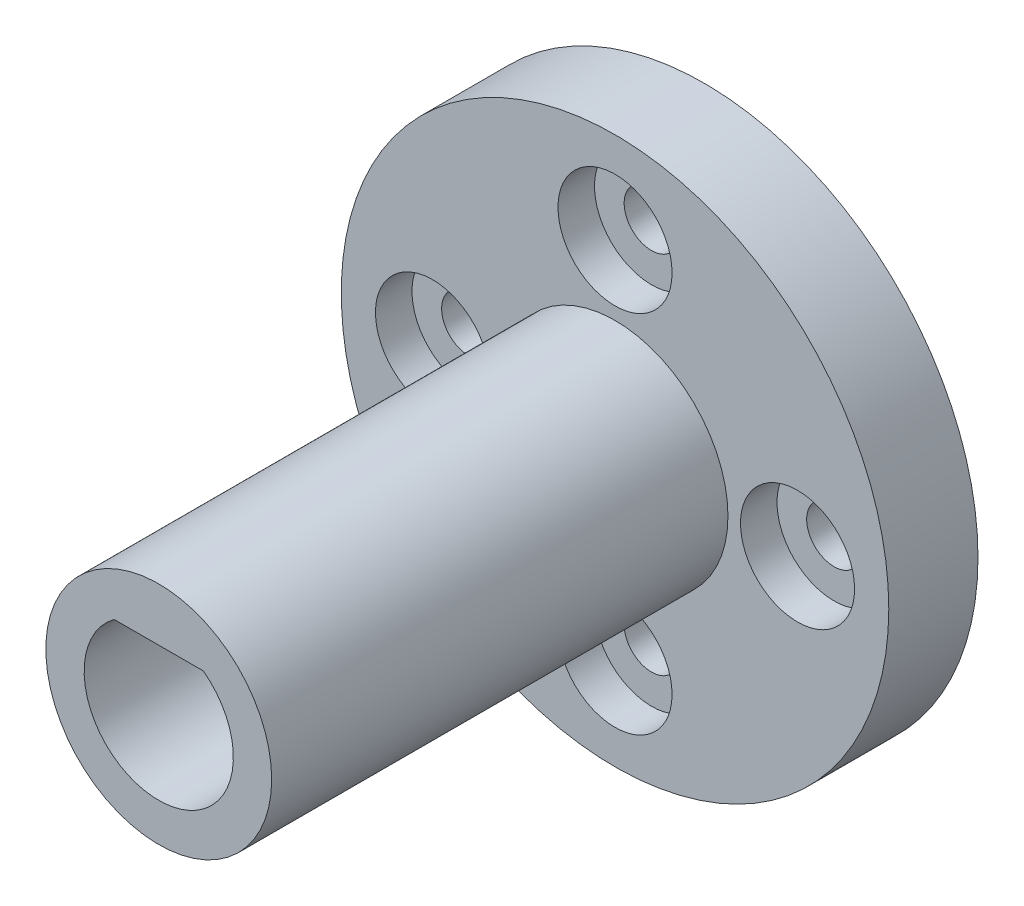
ISO-10303-21;
HEADER;
FILE_DESCRIPTION(('STEP AP214'),'2;1');
FILE_NAME('part.step','',(''),(''),'','','');
FILE_SCHEMA(('AUTOMOTIVE_DESIGN { 1 0 10303 214 1 1 1 1 }'));
ENDSEC;
DATA;
#1=APPLICATION_CONTEXT('core data for automotive mechanical design processes');
#2=APPLICATION_PROTOCOL_DEFINITION('international standard','automotive_design',2000,#1);
#3=PRODUCT_CONTEXT('',#1,'mechanical');
#4=PRODUCT('Part','Part','',(#3));
#5=PRODUCT_RELATED_PRODUCT_CATEGORY('part','',(#4));
#6=PRODUCT_DEFINITION_FORMATION('','',#4);
#7=PRODUCT_DEFINITION_CONTEXT('part definition',#1,'design');
#8=PRODUCT_DEFINITION('design','',#6,#7);
#9=PRODUCT_DEFINITION_SHAPE('','',#8);
#10=(LENGTH_UNIT() NAMED_UNIT(*) SI_UNIT(.MILLI.,.METRE.));
#11=(NAMED_UNIT(*) PLANE_ANGLE_UNIT() SI_UNIT($,.RADIAN.));
#12=(NAMED_UNIT(*) SI_UNIT($,.STERADIAN.) SOLID_ANGLE_UNIT());
#13=UNCERTAINTY_MEASURE_WITH_UNIT(LENGTH_MEASURE(1.E-05),#10,'distance_accuracy_value','');
#14=(GEOMETRIC_REPRESENTATION_CONTEXT(3) GLOBAL_UNCERTAINTY_ASSIGNED_CONTEXT((#13)) GLOBAL_UNIT_ASSIGNED_CONTEXT((#10,
#11,#12)) REPRESENTATION_CONTEXT('',''));
#15=CARTESIAN_POINT('',(0.,0.,0.));
#16=DIRECTION('',(0.,0.,1.));
#17=DIRECTION('',(1.,0.,0.));
#18=AXIS2_PLACEMENT_3D('',#15,#16,#17);
#19=CARTESIAN_POINT('',(0.,0.,3.91));
#20=DIRECTION('',(0.,0.,-1.));
#21=DIRECTION('',(-1.,0.,0.));
#22=AXIS2_PLACEMENT_3D('',#19,#20,#21);
#23=CYLINDRICAL_SURFACE('',#22,12.);
#24=CARTESIAN_POINT('',(0.,0.,3.91));
#25=DIRECTION('',(0.,0.,1.));
#26=DIRECTION('',(1.,0.,0.));
#27=AXIS2_PLACEMENT_3D('',#24,#25,#26);
#28=CIRCLE('',#27,12.);
#29=CARTESIAN_POINT('',(12.,0.,3.91));
#30=VERTEX_POINT('',#29);
#31=EDGE_CURVE('E11',#30,#30,#28,.T.);
#32=ORIENTED_EDGE('',*,*,#31,.F.);
#33=EDGE_LOOP('',(#32));
#34=FACE_BOUND('',#33,.T.);
#35=CARTESIAN_POINT('',(0.,0.,0.));
#36=DIRECTION('',(0.,0.,1.));
#37=DIRECTION('',(1.,0.,0.));
#38=AXIS2_PLACEMENT_3D('',#35,#36,#37);
#39=CIRCLE('',#38,12.);
#40=CARTESIAN_POINT('',(12.,0.,0.));
#41=VERTEX_POINT('',#40);
#42=EDGE_CURVE('E40',#41,#41,#39,.T.);
#43=ORIENTED_EDGE('',*,*,#42,.T.);
#44=EDGE_LOOP('',(#43));
#45=FACE_BOUND('',#44,.T.);
#46=ADVANCED_FACE('F37',(#34,#45),#23,.T.);
#47=CARTESIAN_POINT('',(0.,0.,3.91));
#48=DIRECTION('',(0.,0.,1.));
#49=DIRECTION('',(1.,0.,0.));
#50=AXIS2_PLACEMENT_3D('',#47,#48,#49);
#51=PLANE('',#50);
#52=CARTESIAN_POINT('',(8.,0.,3.91));
#53=DIRECTION('',(0.,0.,1.));
#54=DIRECTION('',(1.,0.,0.));
#55=AXIS2_PLACEMENT_3D('',#52,#53,#54);
#56=CIRCLE('',#55,2.5);
#57=CARTESIAN_POINT('',(10.5,0.,3.91));
#58=VERTEX_POINT('',#57);
#59=EDGE_CURVE('E307',#58,#58,#56,.T.);
#60=ORIENTED_EDGE('',*,*,#59,.F.);
#61=EDGE_LOOP('',(#60));
#62=FACE_BOUND('',#61,.T.);
#63=CARTESIAN_POINT('',(0.,-8.,3.91));
#64=DIRECTION('',(0.,0.,1.));
#65=DIRECTION('',(1.,0.,0.));
#66=AXIS2_PLACEMENT_3D('',#63,#64,#65);
#67=CIRCLE('',#66,2.5);
#68=CARTESIAN_POINT('',(2.5,-8.,3.91));
#69=VERTEX_POINT('',#68);
#70=EDGE_CURVE('E317',#69,#69,#67,.T.);
#71=ORIENTED_EDGE('',*,*,#70,.F.);
#72=EDGE_LOOP('',(#71));
#73=FACE_BOUND('',#72,.T.);
#74=CARTESIAN_POINT('',(-8.,0.,3.91));
#75=DIRECTION('',(0.,0.,1.));
#76=DIRECTION('',(1.,0.,0.));
#77=AXIS2_PLACEMENT_3D('',#74,#75,#76);
#78=CIRCLE('',#77,2.5);
#79=CARTESIAN_POINT('',(-5.50000000000001,0.,3.91));
#80=VERTEX_POINT('',#79);
#81=EDGE_CURVE('E329',#80,#80,#78,.T.);
#82=ORIENTED_EDGE('',*,*,#81,.F.);
#83=EDGE_LOOP('',(#82));
#84=FACE_BOUND('',#83,.T.);
#85=CARTESIAN_POINT('',(0.,8.,3.91));
#86=DIRECTION('',(0.,0.,1.));
#87=DIRECTION('',(1.,0.,0.));
#88=AXIS2_PLACEMENT_3D('',#85,#86,#87);
#89=CIRCLE('',#88,2.5);
#90=CARTESIAN_POINT('',(2.5,8.,3.91));
#91=VERTEX_POINT('',#90);
#92=EDGE_CURVE('E341',#91,#91,#89,.T.);
#93=ORIENTED_EDGE('',*,*,#92,.F.);
#94=EDGE_LOOP('',(#93));
#95=FACE_BOUND('',#94,.T.);
#96=CARTESIAN_POINT('',(0.,0.,3.91));
#97=DIRECTION('',(0.,0.,1.));
#98=DIRECTION('',(1.,0.,0.));
#99=AXIS2_PLACEMENT_3D('',#96,#97,#98);
#100=CIRCLE('',#99,4.95);
#101=CARTESIAN_POINT('',(4.95,0.,3.91));
#102=VERTEX_POINT('',#101);
#103=EDGE_CURVE('E77',#102,#102,#100,.T.);
#104=ORIENTED_EDGE('',*,*,#103,.F.);
#105=EDGE_LOOP('',(#104));
#106=FACE_BOUND('',#105,.T.);
#107=ORIENTED_EDGE('',*,*,#31,.T.);
#108=EDGE_LOOP('',(#107));
#109=FACE_BOUND('',#108,.T.);
#110=ADVANCED_FACE('F96',(#62,#73,#84,#95,#106,#109),#51,.T.);
#111=CARTESIAN_POINT('',(0.,0.,0.));
#112=DIRECTION('',(0.,0.,1.));
#113=DIRECTION('',(1.,0.,0.));
#114=AXIS2_PLACEMENT_3D('',#111,#112,#113);
#115=PLANE('',#114);
#116=CARTESIAN_POINT('',(8.,0.,0.));
#117=DIRECTION('',(0.,0.,1.));
#118=DIRECTION('',(1.,0.,0.));
#119=AXIS2_PLACEMENT_3D('',#116,#117,#118);
#120=CIRCLE('',#119,1.2);
#121=CARTESIAN_POINT('',(9.2,0.,0.));
#122=VERTEX_POINT('',#121);
#123=EDGE_CURVE('E314',#122,#122,#120,.T.);
#124=ORIENTED_EDGE('',*,*,#123,.T.);
#125=EDGE_LOOP('',(#124));
#126=FACE_BOUND('',#125,.T.);
#127=CARTESIAN_POINT('',(0.,-8.,0.));
#128=DIRECTION('',(0.,0.,1.));
#129=DIRECTION('',(1.,0.,0.));
#130=AXIS2_PLACEMENT_3D('',#127,#128,#129);
#131=CIRCLE('',#130,1.2);
#132=CARTESIAN_POINT('',(1.2,-8.,0.));
#133=VERTEX_POINT('',#132);
#134=EDGE_CURVE('E326',#133,#133,#131,.T.);
#135=ORIENTED_EDGE('',*,*,#134,.T.);
#136=EDGE_LOOP('',(#135));
#137=FACE_BOUND('',#136,.T.);
#138=CARTESIAN_POINT('',(-8.,0.,0.));
#139=DIRECTION('',(0.,0.,1.));
#140=DIRECTION('',(1.,0.,0.));
#141=AXIS2_PLACEMENT_3D('',#138,#139,#140);
#142=CIRCLE('',#141,1.2);
#143=CARTESIAN_POINT('',(-6.8,0.,0.));
#144=VERTEX_POINT('',#143);
#145=EDGE_CURVE('E338',#144,#144,#142,.T.);
#146=ORIENTED_EDGE('',*,*,#145,.T.);
#147=EDGE_LOOP('',(#146));
#148=FACE_BOUND('',#147,.T.);
#149=CARTESIAN_POINT('',(0.,8.,0.));
#150=DIRECTION('',(0.,0.,1.));
#151=DIRECTION('',(1.,0.,0.));
#152=AXIS2_PLACEMENT_3D('',#149,#150,#151);
#153=CIRCLE('',#152,1.2);
#154=CARTESIAN_POINT('',(1.2,8.,0.));
#155=VERTEX_POINT('',#154);
#156=EDGE_CURVE('E67',#155,#155,#153,.T.);
#157=ORIENTED_EDGE('',*,*,#156,.T.);
#158=EDGE_LOOP('',(#157));
#159=FACE_BOUND('',#158,.T.);
#160=CARTESIAN_POINT('',(0.,0.,0.));
#161=DIRECTION('',(0.,0.,-1.));
#162=DIRECTION('',(-1.,0.,0.));
#163=AXIS2_PLACEMENT_3D('',#160,#161,#162);
#164=CIRCLE('',#163,4.);
#165=CARTESIAN_POINT('',(-4.,0.,0.));
#166=VERTEX_POINT('',#165);
#167=EDGE_CURVE('E84',#166,#166,#164,.T.);
#168=ORIENTED_EDGE('',*,*,#167,.F.);
#169=EDGE_LOOP('',(#168));
#170=FACE_BOUND('',#169,.T.);
#171=ORIENTED_EDGE('',*,*,#42,.F.);
#172=EDGE_LOOP('',(#171));
#173=FACE_BOUND('',#172,.T.);
#174=ADVANCED_FACE('F93',(#126,#137,#148,#159,#170,#173),#115,.F.);
#175=CARTESIAN_POINT('',(0.,0.,1.91));
#176=DIRECTION('',(0.,0.,-1.));
#177=DIRECTION('',(-1.,0.,0.));
#178=AXIS2_PLACEMENT_3D('',#175,#176,#177);
#179=CYLINDRICAL_SURFACE('',#178,4.);
#180=CARTESIAN_POINT('',(0.,0.,1.91));
#181=DIRECTION('',(0.,0.,-1.));
#182=DIRECTION('',(-1.,0.,0.));
#183=AXIS2_PLACEMENT_3D('',#180,#181,#182);
#184=CIRCLE('',#183,4.);
#185=CARTESIAN_POINT('',(-4.,0.,1.91));
#186=VERTEX_POINT('',#185);
#187=EDGE_CURVE('E85',#186,#186,#184,.T.);
#188=CARTESIAN_POINT('',(-4.,0.,1.91));
#189=CARTESIAN_POINT('',(-4.,0.,1.89010416666667));
#190=CARTESIAN_POINT('',(-4.,0.,1.87020833333333));
#191=CARTESIAN_POINT('',(-4.,0.,1.83041666666667));
#192=CARTESIAN_POINT('',(-4.,0.,1.81052083333333));
#193=CARTESIAN_POINT('',(-4.,0.,1.77072916666667));
#194=CARTESIAN_POINT('',(-4.,0.,1.75083333333333));
#195=CARTESIAN_POINT('',(-4.,0.,1.71104166666667));
#196=CARTESIAN_POINT('',(-4.,0.,1.69114583333333));
#197=CARTESIAN_POINT('',(-4.,0.,1.65135416666667));
#198=CARTESIAN_POINT('',(-4.,0.,1.63145833333333));
#199=CARTESIAN_POINT('',(-4.,0.,1.59166666666667));
#200=CARTESIAN_POINT('',(-4.,0.,1.57177083333333));
#201=CARTESIAN_POINT('',(-4.,0.,1.53197916666667));
#202=CARTESIAN_POINT('',(-4.,0.,1.51208333333333));
#203=CARTESIAN_POINT('',(-4.,0.,1.47229166666667));
#204=CARTESIAN_POINT('',(-4.,0.,1.45239583333333));
#205=CARTESIAN_POINT('',(-4.,0.,1.41260416666667));
#206=CARTESIAN_POINT('',(-4.,0.,1.39270833333333));
#207=CARTESIAN_POINT('',(-4.,0.,1.35291666666667));
#208=CARTESIAN_POINT('',(-4.,0.,1.33302083333333));
#209=CARTESIAN_POINT('',(-4.,0.,1.29322916666667));
#210=CARTESIAN_POINT('',(-4.,0.,1.27333333333333));
#211=CARTESIAN_POINT('',(-4.,0.,1.23354166666667));
#212=CARTESIAN_POINT('',(-4.,0.,1.21364583333333));
#213=CARTESIAN_POINT('',(-4.,0.,1.17385416666667));
#214=CARTESIAN_POINT('',(-4.,0.,1.15395833333333));
#215=CARTESIAN_POINT('',(-4.,0.,1.11416666666667));
#216=CARTESIAN_POINT('',(-4.,0.,1.09427083333333));
#217=CARTESIAN_POINT('',(-4.,0.,1.05447916666667));
#218=CARTESIAN_POINT('',(-4.,0.,1.03458333333333));
#219=CARTESIAN_POINT('',(-4.,0.,0.994791666666667));
#220=CARTESIAN_POINT('',(-4.,0.,0.974895833333334));
#221=CARTESIAN_POINT('',(-4.,0.,0.935104166666667));
#222=CARTESIAN_POINT('',(-4.,0.,0.915208333333333));
#223=CARTESIAN_POINT('',(-4.,0.,0.875416666666667));
#224=CARTESIAN_POINT('',(-4.,0.,0.855520833333333));
#225=CARTESIAN_POINT('',(-4.,0.,0.815729166666667));
#226=CARTESIAN_POINT('',(-4.,0.,0.795833333333333));
#227=CARTESIAN_POINT('',(-4.,0.,0.756041666666667));
#228=CARTESIAN_POINT('',(-4.,0.,0.736145833333333));
#229=CARTESIAN_POINT('',(-4.,0.,0.696354166666667));
#230=CARTESIAN_POINT('',(-4.,0.,0.676458333333333));
#231=CARTESIAN_POINT('',(-4.,0.,0.636666666666667));
#232=CARTESIAN_POINT('',(-4.,0.,0.616770833333333));
#233=CARTESIAN_POINT('',(-4.,0.,0.576979166666667));
#234=CARTESIAN_POINT('',(-4.,0.,0.557083333333333));
#235=CARTESIAN_POINT('',(-4.,0.,0.517291666666667));
#236=CARTESIAN_POINT('',(-4.,0.,0.497395833333333));
#237=CARTESIAN_POINT('',(-4.,0.,0.457604166666667));
#238=CARTESIAN_POINT('',(-4.,0.,0.437708333333333));
#239=CARTESIAN_POINT('',(-4.,0.,0.397916666666667));
#240=CARTESIAN_POINT('',(-4.,0.,0.378020833333333));
#241=CARTESIAN_POINT('',(-4.,0.,0.338229166666667));
#242=CARTESIAN_POINT('',(-4.,0.,0.318333333333333));
#243=CARTESIAN_POINT('',(-4.,0.,0.278541666666667));
#244=CARTESIAN_POINT('',(-4.,0.,0.258645833333333));
#245=CARTESIAN_POINT('',(-4.,0.,0.218854166666667));
#246=CARTESIAN_POINT('',(-4.,0.,0.198958333333333));
#247=CARTESIAN_POINT('',(-4.,0.,0.159166666666667));
#248=CARTESIAN_POINT('',(-4.,0.,0.139270833333333));
#249=CARTESIAN_POINT('',(-4.,0.,0.0994791666666668));
#250=CARTESIAN_POINT('',(-4.,0.,0.0795833333333334));
#251=CARTESIAN_POINT('',(-4.,0.,0.0397916666666667));
#252=CARTESIAN_POINT('',(-4.,0.,0.0198958333333334));
#253=CARTESIAN_POINT('',(-4.,0.,0.));
#254=B_SPLINE_CURVE_WITH_KNOTS('',3,(#188,#189,#190,#191,#192,#193,#194,#195,#196,#197,#198,
#199,#200,#201,#202,#203,#204,#205,#206,#207,#208,#209,#210,#211,#212,#213,#214,#215,#216,#217,
#218,#219,#220,#221,#222,#223,#224,#225,#226,#227,#228,#229,#230,#231,#232,#233,#234,#235,#236,
#237,#238,#239,#240,#241,#242,#243,#244,#245,#246,#247,#248,#249,#250,#251,#252,#253),
.UNSPECIFIED.,.F.,.F.,(4,2,2,2,2,2,2,2,2,2,2,2,2,2,2,2,2,2,2,2,2,2,2,2,2,2,2,2,2,2,2,2,4),(0.,
0.0596874999999998,0.119375,0.1790625,0.23875,0.2984375,0.358125,0.4178125,0.4775,0.5371875,
0.596875,0.6565625,0.71625,0.7759375,0.835625,0.8953125,0.955,1.0146875,1.074375,1.1340625,
1.19375,1.2534375,1.313125,1.3728125,1.4325,1.4921875,1.551875,1.6115625,1.67125,1.7309375,
1.790625,1.8503125,1.91),.UNSPECIFIED.);
#255=EDGE_CURVE('BSEAM91',#186,#166,#254,.T.);
#256=ORIENTED_EDGE('',*,*,#187,.F.);
#257=ORIENTED_EDGE('',*,*,#167,.T.);
#258=ORIENTED_EDGE('',*,*,#255,.T.);
#259=ORIENTED_EDGE('',*,*,#255,.F.);
#260=EDGE_LOOP('',(#256,#258,#257,#259));
#261=FACE_BOUND('',#260,.T.);
#262=ADVANCED_FACE('F91',(#261),#179,.F.);
#263=CARTESIAN_POINT('',(0.,0.,1.91));
#264=DIRECTION('',(0.,0.,-1.));
#265=DIRECTION('',(-1.,0.,0.));
#266=AXIS2_PLACEMENT_3D('',#263,#264,#265);
#267=PLANE('',#266);
#268=ORIENTED_EDGE('',*,*,#187,.T.);
#269=EDGE_LOOP('',(#268));
#270=FACE_BOUND('',#269,.T.);
#271=ADVANCED_FACE('F140',(#270),#267,.T.);
#272=CARTESIAN_POINT('',(0.,2.62,23.91));
#273=DIRECTION('',(0.,-1.,0.));
#274=DIRECTION('',(0.,0.,-1.));
#275=AXIS2_PLACEMENT_3D('',#272,#273,#274);
#276=PLANE('',#275);
#277=DIRECTION('',(-1.,0.,0.));
#278=VECTOR('',#277,1.);
#279=CARTESIAN_POINT('',(0.,2.62,3.91));
#280=LINE('',#279,#278);
#281=CARTESIAN_POINT('',(1.95665530945029,2.62,3.91));
#282=VERTEX_POINT('',#281);
#283=CARTESIAN_POINT('',(-1.95665530945029,2.62,3.91));
#284=VERTEX_POINT('',#283);
#285=EDGE_CURVE('E64',#282,#284,#280,.T.);
#286=ORIENTED_EDGE('',*,*,#285,.F.);
#287=DIRECTION('',(0.,0.,-1.));
#288=VECTOR('',#287,1.);
#289=CARTESIAN_POINT('',(1.95665530945029,2.62,23.91));
#290=LINE('',#289,#288);
#291=CARTESIAN_POINT('',(1.95665530945029,2.62,23.91));
#292=VERTEX_POINT('',#291);
#293=EDGE_CURVE('E73',#292,#282,#290,.T.);
#294=ORIENTED_EDGE('',*,*,#293,.F.);
#295=DIRECTION('',(-1.,0.,0.));
#296=VECTOR('',#295,1.);
#297=CARTESIAN_POINT('',(0.,2.62,23.91));
#298=LINE('',#297,#296);
#299=CARTESIAN_POINT('',(-1.95665530945029,2.62,23.91));
#300=VERTEX_POINT('',#299);
#301=EDGE_CURVE('E71',#292,#300,#298,.T.);
#302=ORIENTED_EDGE('',*,*,#301,.T.);
#303=DIRECTION('',(0.,0.,-1.));
#304=VECTOR('',#303,1.);
#305=CARTESIAN_POINT('',(-1.95665530945029,2.62,23.91));
#306=LINE('',#305,#304);
#307=EDGE_CURVE('E58',#300,#284,#306,.T.);
#308=ORIENTED_EDGE('',*,*,#307,.T.);
#309=EDGE_LOOP('',(#286,#294,#302,#308));
#310=FACE_BOUND('',#309,.T.);
#311=ADVANCED_FACE('F69',(#310),#276,.T.);
#312=CARTESIAN_POINT('',(0.,0.,23.91));
#313=DIRECTION('',(0.,0.,-1.));
#314=DIRECTION('',(-1.,0.,0.));
#315=AXIS2_PLACEMENT_3D('',#312,#313,#314);
#316=CYLINDRICAL_SURFACE('',#315,3.27);
#317=CARTESIAN_POINT('',(0.,0.,3.91));
#318=DIRECTION('',(0.,0.,1.));
#319=DIRECTION('',(1.,0.,0.));
#320=AXIS2_PLACEMENT_3D('',#317,#318,#319);
#321=CIRCLE('',#320,3.27);
#322=EDGE_CURVE('E50',#284,#282,#321,.T.);
#323=ORIENTED_EDGE('',*,*,#322,.F.);
#324=ORIENTED_EDGE('',*,*,#307,.F.);
#325=CARTESIAN_POINT('',(0.,0.,23.91));
#326=DIRECTION('',(0.,0.,1.));
#327=DIRECTION('',(1.,0.,0.));
#328=AXIS2_PLACEMENT_3D('',#325,#326,#327);
#329=CIRCLE('',#328,3.27);
#330=EDGE_CURVE('E353',#300,#292,#329,.T.);
#331=ORIENTED_EDGE('',*,*,#330,.T.);
#332=ORIENTED_EDGE('',*,*,#293,.T.);
#333=EDGE_LOOP('',(#323,#324,#331,#332));
#334=FACE_BOUND('',#333,.T.);
#335=ADVANCED_FACE('F76',(#334),#316,.F.);
#336=CARTESIAN_POINT('',(0.,0.,23.91));
#337=DIRECTION('',(0.,0.,-1.));
#338=DIRECTION('',(-1.,0.,0.));
#339=AXIS2_PLACEMENT_3D('',#336,#337,#338);
#340=CYLINDRICAL_SURFACE('',#339,4.95);
#341=CARTESIAN_POINT('',(0.,0.,23.91));
#342=DIRECTION('',(0.,0.,1.));
#343=DIRECTION('',(1.,0.,0.));
#344=AXIS2_PLACEMENT_3D('',#341,#342,#343);
#345=CIRCLE('',#344,4.95);
#346=CARTESIAN_POINT('',(4.95,0.,23.91));
#347=VERTEX_POINT('',#346);
#348=EDGE_CURVE('E74',#347,#347,#345,.T.);
#349=ORIENTED_EDGE('',*,*,#348,.F.);
#350=EDGE_LOOP('',(#349));
#351=FACE_BOUND('',#350,.T.);
#352=ORIENTED_EDGE('',*,*,#103,.T.);
#353=EDGE_LOOP('',(#352));
#354=FACE_BOUND('',#353,.T.);
#355=ADVANCED_FACE('F125',(#351,#354),#340,.T.);
#356=CARTESIAN_POINT('',(0.,0.,23.91));
#357=DIRECTION('',(0.,0.,1.));
#358=DIRECTION('',(1.,0.,0.));
#359=AXIS2_PLACEMENT_3D('',#356,#357,#358);
#360=PLANE('',#359);
#361=ORIENTED_EDGE('',*,*,#301,.F.);
#362=ORIENTED_EDGE('',*,*,#330,.F.);
#363=EDGE_LOOP('',(#361,#362));
#364=FACE_BOUND('',#363,.T.);
#365=ORIENTED_EDGE('',*,*,#348,.T.);
#366=EDGE_LOOP('',(#365));
#367=FACE_BOUND('',#366,.T.);
#368=ADVANCED_FACE('F117',(#364,#367),#360,.T.);
#369=ORIENTED_EDGE('',*,*,#285,.T.);
#370=ORIENTED_EDGE('',*,*,#322,.T.);
#371=EDGE_LOOP('',(#369,#370));
#372=FACE_BOUND('',#371,.T.);
#373=ADVANCED_FACE('F65',(#372),#51,.T.);
#374=CARTESIAN_POINT('',(0.,8.,3.91));
#375=DIRECTION('',(0.,0.,1.));
#376=DIRECTION('',(1.,0.,0.));
#377=AXIS2_PLACEMENT_3D('',#374,#375,#376);
#378=CYLINDRICAL_SURFACE('',#377,1.2);
#379=ORIENTED_EDGE('',*,*,#156,.F.);
#380=EDGE_LOOP('',(#379));
#381=FACE_BOUND('',#380,.T.);
#382=CARTESIAN_POINT('',(0.,8.,2.31));
#383=DIRECTION('',(0.,0.,1.));
#384=DIRECTION('',(1.,0.,0.));
#385=AXIS2_PLACEMENT_3D('',#382,#383,#384);
#386=CIRCLE('',#385,1.2);
#387=CARTESIAN_POINT('',(1.2,8.,2.31));
#388=VERTEX_POINT('',#387);
#389=EDGE_CURVE('E347',#388,#388,#386,.T.);
#390=ORIENTED_EDGE('',*,*,#389,.T.);
#391=EDGE_LOOP('',(#390));
#392=FACE_BOUND('',#391,.T.);
#393=ADVANCED_FACE('F116',(#381,#392),#378,.F.);
#394=CARTESIAN_POINT('',(1.2,8.,2.31));
#395=DIRECTION('',(0.,0.,-1.));
#396=DIRECTION('',(-1.,0.,0.));
#397=AXIS2_PLACEMENT_3D('',#394,#395,#396);
#398=PLANE('',#397);
#399=ORIENTED_EDGE('',*,*,#389,.F.);
#400=EDGE_LOOP('',(#399));
#401=FACE_BOUND('',#400,.T.);
#402=CARTESIAN_POINT('',(0.,8.,2.31));
#403=DIRECTION('',(0.,0.,1.));
#404=DIRECTION('',(1.,0.,0.));
#405=AXIS2_PLACEMENT_3D('',#402,#403,#404);
#406=CIRCLE('',#405,2.5);
#407=CARTESIAN_POINT('',(2.5,8.,2.31));
#408=VERTEX_POINT('',#407);
#409=EDGE_CURVE('E344',#408,#408,#406,.T.);
#410=ORIENTED_EDGE('',*,*,#409,.T.);
#411=EDGE_LOOP('',(#410));
#412=FACE_BOUND('',#411,.T.);
#413=ADVANCED_FACE('F122',(#401,#412),#398,.F.);
#414=CARTESIAN_POINT('',(0.,8.,3.91));
#415=DIRECTION('',(0.,0.,1.));
#416=DIRECTION('',(1.,0.,0.));
#417=AXIS2_PLACEMENT_3D('',#414,#415,#416);
#418=CYLINDRICAL_SURFACE('',#417,2.5);
#419=ORIENTED_EDGE('',*,*,#409,.F.);
#420=EDGE_LOOP('',(#419));
#421=FACE_BOUND('',#420,.T.);
#422=ORIENTED_EDGE('',*,*,#92,.T.);
#423=EDGE_LOOP('',(#422));
#424=FACE_BOUND('',#423,.T.);
#425=ADVANCED_FACE('F190',(#421,#424),#418,.F.);
#426=CARTESIAN_POINT('',(-8.,0.,3.91));
#427=DIRECTION('',(0.,0.,1.));
#428=DIRECTION('',(1.,0.,0.));
#429=AXIS2_PLACEMENT_3D('',#426,#427,#428);
#430=CYLINDRICAL_SURFACE('',#429,1.2);
#431=ORIENTED_EDGE('',*,*,#145,.F.);
#432=EDGE_LOOP('',(#431));
#433=FACE_BOUND('',#432,.T.);
#434=CARTESIAN_POINT('',(-8.,0.,2.31));
#435=DIRECTION('',(0.,0.,1.));
#436=DIRECTION('',(1.,0.,0.));
#437=AXIS2_PLACEMENT_3D('',#434,#435,#436);
#438=CIRCLE('',#437,1.2);
#439=CARTESIAN_POINT('',(-6.8,0.,2.31));
#440=VERTEX_POINT('',#439);
#441=EDGE_CURVE('E335',#440,#440,#438,.T.);
#442=ORIENTED_EDGE('',*,*,#441,.T.);
#443=EDGE_LOOP('',(#442));
#444=FACE_BOUND('',#443,.T.);
#445=ADVANCED_FACE('F198',(#433,#444),#430,.F.);
#446=CARTESIAN_POINT('',(-6.8,0.,2.31));
#447=DIRECTION('',(0.,0.,-1.));
#448=DIRECTION('',(-1.,0.,0.));
#449=AXIS2_PLACEMENT_3D('',#446,#447,#448);
#450=PLANE('',#449);
#451=ORIENTED_EDGE('',*,*,#441,.F.);
#452=EDGE_LOOP('',(#451));
#453=FACE_BOUND('',#452,.T.);
#454=CARTESIAN_POINT('',(-8.,0.,2.31));
#455=DIRECTION('',(0.,0.,1.));
#456=DIRECTION('',(1.,0.,0.));
#457=AXIS2_PLACEMENT_3D('',#454,#455,#456);
#458=CIRCLE('',#457,2.5);
#459=CARTESIAN_POINT('',(-5.5,0.,2.31));
#460=VERTEX_POINT('',#459);
#461=EDGE_CURVE('E332',#460,#460,#458,.T.);
#462=ORIENTED_EDGE('',*,*,#461,.T.);
#463=EDGE_LOOP('',(#462));
#464=FACE_BOUND('',#463,.T.);
#465=ADVANCED_FACE('F218',(#453,#464),#450,.F.);
#466=CARTESIAN_POINT('',(-8.,0.,3.91));
#467=DIRECTION('',(0.,0.,1.));
#468=DIRECTION('',(1.,0.,0.));
#469=AXIS2_PLACEMENT_3D('',#466,#467,#468);
#470=CYLINDRICAL_SURFACE('',#469,2.5);
#471=ORIENTED_EDGE('',*,*,#461,.F.);
#472=EDGE_LOOP('',(#471));
#473=FACE_BOUND('',#472,.T.);
#474=ORIENTED_EDGE('',*,*,#81,.T.);
#475=EDGE_LOOP('',(#474));
#476=FACE_BOUND('',#475,.T.);
#477=ADVANCED_FACE('F228',(#473,#476),#470,.F.);
#478=CARTESIAN_POINT('',(0.,-8.,3.91));
#479=DIRECTION('',(0.,0.,1.));
#480=DIRECTION('',(1.,0.,0.));
#481=AXIS2_PLACEMENT_3D('',#478,#479,#480);
#482=CYLINDRICAL_SURFACE('',#481,1.2);
#483=ORIENTED_EDGE('',*,*,#134,.F.);
#484=EDGE_LOOP('',(#483));
#485=FACE_BOUND('',#484,.T.);
#486=CARTESIAN_POINT('',(0.,-8.,2.31));
#487=DIRECTION('',(0.,0.,1.));
#488=DIRECTION('',(1.,0.,0.));
#489=AXIS2_PLACEMENT_3D('',#486,#487,#488);
#490=CIRCLE('',#489,1.2);
#491=CARTESIAN_POINT('',(1.2,-8.,2.31));
#492=VERTEX_POINT('',#491);
#493=EDGE_CURVE('E323',#492,#492,#490,.T.);
#494=ORIENTED_EDGE('',*,*,#493,.T.);
#495=EDGE_LOOP('',(#494));
#496=FACE_BOUND('',#495,.T.);
#497=ADVANCED_FACE('F238',(#485,#496),#482,.F.);
#498=CARTESIAN_POINT('',(1.2,-8.,2.31));
#499=DIRECTION('',(0.,0.,-1.));
#500=DIRECTION('',(-1.,0.,0.));
#501=AXIS2_PLACEMENT_3D('',#498,#499,#500);
#502=PLANE('',#501);
#503=ORIENTED_EDGE('',*,*,#493,.F.);
#504=EDGE_LOOP('',(#503));
#505=FACE_BOUND('',#504,.T.);
#506=CARTESIAN_POINT('',(0.,-8.,2.31));
#507=DIRECTION('',(0.,0.,1.));
#508=DIRECTION('',(1.,0.,0.));
#509=AXIS2_PLACEMENT_3D('',#506,#507,#508);
#510=CIRCLE('',#509,2.5);
#511=CARTESIAN_POINT('',(2.5,-8.,2.31));
#512=VERTEX_POINT('',#511);
#513=EDGE_CURVE('E320',#512,#512,#510,.T.);
#514=ORIENTED_EDGE('',*,*,#513,.T.);
#515=EDGE_LOOP('',(#514));
#516=FACE_BOUND('',#515,.T.);
#517=ADVANCED_FACE('F248',(#505,#516),#502,.F.);
#518=CARTESIAN_POINT('',(0.,-8.,3.91));
#519=DIRECTION('',(0.,0.,1.));
#520=DIRECTION('',(1.,0.,0.));
#521=AXIS2_PLACEMENT_3D('',#518,#519,#520);
#522=CYLINDRICAL_SURFACE('',#521,2.5);
#523=ORIENTED_EDGE('',*,*,#513,.F.);
#524=EDGE_LOOP('',(#523));
#525=FACE_BOUND('',#524,.T.);
#526=ORIENTED_EDGE('',*,*,#70,.T.);
#527=EDGE_LOOP('',(#526));
#528=FACE_BOUND('',#527,.T.);
#529=ADVANCED_FACE('F258',(#525,#528),#522,.F.);
#530=CARTESIAN_POINT('',(8.,0.,3.91));
#531=DIRECTION('',(0.,0.,1.));
#532=DIRECTION('',(1.,0.,0.));
#533=AXIS2_PLACEMENT_3D('',#530,#531,#532);
#534=CYLINDRICAL_SURFACE('',#533,1.2);
#535=ORIENTED_EDGE('',*,*,#123,.F.);
#536=EDGE_LOOP('',(#535));
#537=FACE_BOUND('',#536,.T.);
#538=CARTESIAN_POINT('',(8.,0.,2.31));
#539=DIRECTION('',(0.,0.,1.));
#540=DIRECTION('',(1.,0.,0.));
#541=AXIS2_PLACEMENT_3D('',#538,#539,#540);
#542=CIRCLE('',#541,1.2);
#543=CARTESIAN_POINT('',(9.2,0.,2.31));
#544=VERTEX_POINT('',#543);
#545=EDGE_CURVE('E309',#544,#544,#542,.T.);
#546=ORIENTED_EDGE('',*,*,#545,.T.);
#547=EDGE_LOOP('',(#546));
#548=FACE_BOUND('',#547,.T.);
#549=ADVANCED_FACE('F268',(#537,#548),#534,.F.);
#550=CARTESIAN_POINT('',(9.2,0.,2.31));
#551=DIRECTION('',(0.,0.,-1.));
#552=DIRECTION('',(-1.,0.,0.));
#553=AXIS2_PLACEMENT_3D('',#550,#551,#552);
#554=PLANE('',#553);
#555=ORIENTED_EDGE('',*,*,#545,.F.);
#556=EDGE_LOOP('',(#555));
#557=FACE_BOUND('',#556,.T.);
#558=CARTESIAN_POINT('',(8.,0.,2.31));
#559=DIRECTION('',(0.,0.,1.));
#560=DIRECTION('',(1.,0.,0.));
#561=AXIS2_PLACEMENT_3D('',#558,#559,#560);
#562=CIRCLE('',#561,2.5);
#563=CARTESIAN_POINT('',(10.5,0.,2.31));
#564=VERTEX_POINT('',#563);
#565=EDGE_CURVE('E305',#564,#564,#562,.T.);
#566=ORIENTED_EDGE('',*,*,#565,.T.);
#567=EDGE_LOOP('',(#566));
#568=FACE_BOUND('',#567,.T.);
#569=ADVANCED_FACE('F278',(#557,#568),#554,.F.);
#570=CARTESIAN_POINT('',(8.,0.,3.91));
#571=DIRECTION('',(0.,0.,1.));
#572=DIRECTION('',(1.,0.,0.));
#573=AXIS2_PLACEMENT_3D('',#570,#571,#572);
#574=CYLINDRICAL_SURFACE('',#573,2.5);
#575=ORIENTED_EDGE('',*,*,#565,.F.);
#576=EDGE_LOOP('',(#575));
#577=FACE_BOUND('',#576,.T.);
#578=ORIENTED_EDGE('',*,*,#59,.T.);
#579=EDGE_LOOP('',(#578));
#580=FACE_BOUND('',#579,.T.);
#581=ADVANCED_FACE('F288',(#577,#580),#574,.F.);
#582=CLOSED_SHELL('',(#46,#110,#174,#262,#271,#311,#335,#355,#368,#373,#393,#413,#425,#445,#465,
#477,#497,#517,#529,#549,#569,#581));
#583=MANIFOLD_SOLID_BREP('B2',#582);
#584=ADVANCED_BREP_SHAPE_REPRESENTATION('',(#18,#583),#14);
#585=SHAPE_DEFINITION_REPRESENTATION(#9,#584);
ENDSEC;
END-ISO-10303-21;
